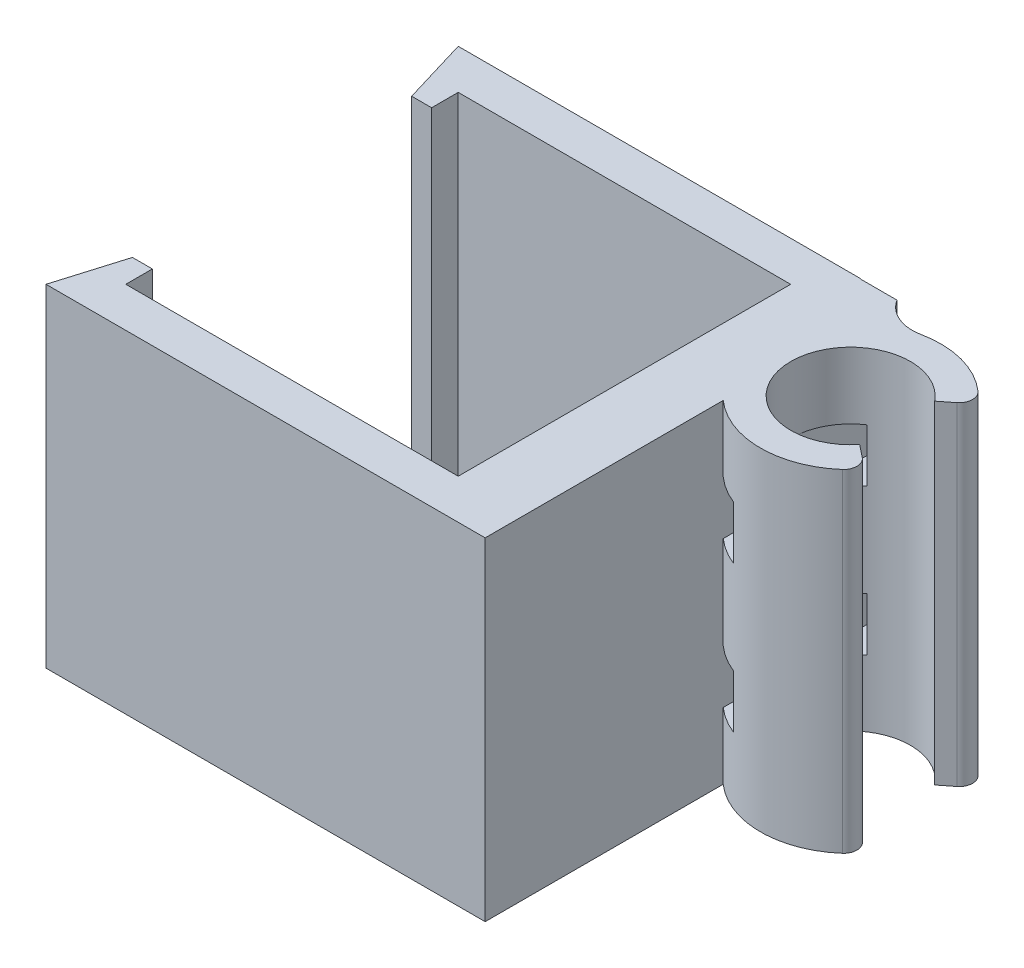
ISO-10303-21;
HEADER;
FILE_DESCRIPTION(('STEP AP214'),'2;1');
FILE_NAME('part.step','',(''),(''),'','','');
FILE_SCHEMA(('AUTOMOTIVE_DESIGN { 1 0 10303 214 1 1 1 1 }'));
ENDSEC;
DATA;
#1=APPLICATION_CONTEXT('core data for automotive mechanical design processes');
#2=APPLICATION_PROTOCOL_DEFINITION('international standard','automotive_design',2000,#1);
#3=PRODUCT_CONTEXT('',#1,'mechanical');
#4=PRODUCT('Part','Part','',(#3));
#5=PRODUCT_RELATED_PRODUCT_CATEGORY('part','',(#4));
#6=PRODUCT_DEFINITION_FORMATION('','',#4);
#7=PRODUCT_DEFINITION_CONTEXT('part definition',#1,'design');
#8=PRODUCT_DEFINITION('design','',#6,#7);
#9=PRODUCT_DEFINITION_SHAPE('','',#8);
#10=(LENGTH_UNIT() NAMED_UNIT(*) SI_UNIT(.MILLI.,.METRE.));
#11=(NAMED_UNIT(*) PLANE_ANGLE_UNIT() SI_UNIT($,.RADIAN.));
#12=(NAMED_UNIT(*) SI_UNIT($,.STERADIAN.) SOLID_ANGLE_UNIT());
#13=UNCERTAINTY_MEASURE_WITH_UNIT(LENGTH_MEASURE(1.E-05),#10,'distance_accuracy_value','');
#14=(GEOMETRIC_REPRESENTATION_CONTEXT(3) GLOBAL_UNCERTAINTY_ASSIGNED_CONTEXT((#13)) GLOBAL_UNIT_ASSIGNED_CONTEXT((#10,
#11,#12)) REPRESENTATION_CONTEXT('',''));
#15=CARTESIAN_POINT('',(0.,0.,0.));
#16=DIRECTION('',(0.,0.,1.));
#17=DIRECTION('',(1.,0.,0.));
#18=AXIS2_PLACEMENT_3D('',#15,#16,#17);
#19=CARTESIAN_POINT('',(-36.5790075050805,25.,-34.9697397940122));
#20=DIRECTION('',(0.,0.,1.));
#21=DIRECTION('',(1.,0.,0.));
#22=AXIS2_PLACEMENT_3D('',#19,#20,#21);
#23=PLANE('',#22);
#24=DIRECTION('',(-1.,0.,0.));
#25=VECTOR('',#24,1.);
#26=CARTESIAN_POINT('',(-36.5790075050805,0.,-34.9697397940122));
#27=LINE('',#26,#25);
#28=CARTESIAN_POINT('',(-36.5790075050805,0.,-34.9697397940122));
#29=VERTEX_POINT('',#28);
#30=CARTESIAN_POINT('',(-66.8257575757576,0.,-34.9697397940122));
#31=VERTEX_POINT('',#30);
#32=EDGE_CURVE('E305',#29,#31,#27,.T.);
#33=ORIENTED_EDGE('',*,*,#32,.T.);
#34=DIRECTION('',(0.,-1.,0.));
#35=VECTOR('',#34,1.);
#36=CARTESIAN_POINT('',(-66.8257575757576,25.,-34.9697397940122));
#37=LINE('',#36,#35);
#38=CARTESIAN_POINT('',(-66.8257575757576,25.,-34.9697397940122));
#39=VERTEX_POINT('',#38);
#40=EDGE_CURVE('E372',#39,#31,#37,.T.);
#41=ORIENTED_EDGE('',*,*,#40,.F.);
#42=DIRECTION('',(-1.,0.,0.));
#43=VECTOR('',#42,1.);
#44=CARTESIAN_POINT('',(-36.5790075050805,25.,-34.9697397940122));
#45=LINE('',#44,#43);
#46=CARTESIAN_POINT('',(-36.5790075050805,25.,-34.9697397940122));
#47=VERTEX_POINT('',#46);
#48=EDGE_CURVE('E312',#47,#39,#45,.T.);
#49=ORIENTED_EDGE('',*,*,#48,.F.);
#50=DIRECTION('',(0.,-1.,0.));
#51=VECTOR('',#50,1.);
#52=CARTESIAN_POINT('',(-36.5790075050805,25.,-34.9697397940122));
#53=LINE('',#52,#51);
#54=EDGE_CURVE('E330',#47,#29,#53,.T.);
#55=ORIENTED_EDGE('',*,*,#54,.T.);
#56=EDGE_LOOP('',(#33,#41,#49,#55));
#57=FACE_BOUND('',#56,.T.);
#58=ADVANCED_FACE('F35',(#57),#23,.F.);
#59=CARTESIAN_POINT('',(-66.8257575757576,25.,-29.9697397940122));
#60=DIRECTION('',(0.,0.,-1.));
#61=DIRECTION('',(-1.,0.,0.));
#62=AXIS2_PLACEMENT_3D('',#59,#60,#61);
#63=PLANE('',#62);
#64=DIRECTION('',(1.,0.,0.));
#65=VECTOR('',#64,1.);
#66=CARTESIAN_POINT('',(-66.8257575757576,25.,-29.9697397940122));
#67=LINE('',#66,#65);
#68=CARTESIAN_POINT('',(-65.3257575757576,25.,-29.9697397940122));
#69=VERTEX_POINT('',#68);
#70=CARTESIAN_POINT('',(-63.8257575757576,25.,-29.9697397940122));
#71=VERTEX_POINT('',#70);
#72=EDGE_CURVE('E315',#69,#71,#67,.T.);
#73=ORIENTED_EDGE('',*,*,#72,.F.);
#74=DIRECTION('',(0.,-1.,0.));
#75=VECTOR('',#74,1.);
#76=CARTESIAN_POINT('',(-65.3257575757576,25.,-29.9697397940122));
#77=LINE('',#76,#75);
#78=CARTESIAN_POINT('',(-65.3257575757576,0.,-29.9697397940122));
#79=VERTEX_POINT('',#78);
#80=EDGE_CURVE('E303',#69,#79,#77,.T.);
#81=ORIENTED_EDGE('',*,*,#80,.T.);
#82=DIRECTION('',(1.,0.,0.));
#83=VECTOR('',#82,1.);
#84=CARTESIAN_POINT('',(-66.8257575757576,0.,-29.9697397940122));
#85=LINE('',#84,#83);
#86=CARTESIAN_POINT('',(-63.8257575757576,0.,-29.9697397940122));
#87=VERTEX_POINT('',#86);
#88=EDGE_CURVE('E333',#79,#87,#85,.T.);
#89=ORIENTED_EDGE('',*,*,#88,.T.);
#90=DIRECTION('',(0.,-1.,0.));
#91=VECTOR('',#90,1.);
#92=CARTESIAN_POINT('',(-63.8257575757576,25.,-29.9697397940122));
#93=LINE('',#92,#91);
#94=EDGE_CURVE('E369',#71,#87,#93,.T.);
#95=ORIENTED_EDGE('',*,*,#94,.F.);
#96=EDGE_LOOP('',(#73,#81,#89,#95));
#97=FACE_BOUND('',#96,.T.);
#98=ADVANCED_FACE('F573',(#97),#63,.F.);
#99=CARTESIAN_POINT('',(-63.8257575757576,25.,-29.9697397940122));
#100=DIRECTION('',(-1.,0.,0.));
#101=DIRECTION('',(0.,0.,1.));
#102=AXIS2_PLACEMENT_3D('',#99,#100,#101);
#103=PLANE('',#102);
#104=DIRECTION('',(0.,0.,-1.));
#105=VECTOR('',#104,1.);
#106=CARTESIAN_POINT('',(-63.8257575757576,0.,-29.9697397940122));
#107=LINE('',#106,#105);
#108=CARTESIAN_POINT('',(-63.8257575757576,0.,-31.9697397940122));
#109=VERTEX_POINT('',#108);
#110=EDGE_CURVE('E335',#87,#109,#107,.T.);
#111=ORIENTED_EDGE('',*,*,#110,.T.);
#112=DIRECTION('',(0.,-1.,0.));
#113=VECTOR('',#112,1.);
#114=CARTESIAN_POINT('',(-63.8257575757576,25.,-31.9697397940122));
#115=LINE('',#114,#113);
#116=CARTESIAN_POINT('',(-63.8257575757576,25.,-31.9697397940122));
#117=VERTEX_POINT('',#116);
#118=EDGE_CURVE('E366',#117,#109,#115,.T.);
#119=ORIENTED_EDGE('',*,*,#118,.F.);
#120=DIRECTION('',(0.,0.,-1.));
#121=VECTOR('',#120,1.);
#122=CARTESIAN_POINT('',(-63.8257575757576,25.,-29.9697397940122));
#123=LINE('',#122,#121);
#124=EDGE_CURVE('E318',#71,#117,#123,.T.);
#125=ORIENTED_EDGE('',*,*,#124,.F.);
#126=ORIENTED_EDGE('',*,*,#94,.T.);
#127=EDGE_LOOP('',(#111,#119,#125,#126));
#128=FACE_BOUND('',#127,.T.);
#129=ADVANCED_FACE('F579',(#128),#103,.F.);
#130=CARTESIAN_POINT('',(-63.8257575757576,25.,-31.9697397940122));
#131=DIRECTION('',(0.,0.,-1.));
#132=DIRECTION('',(-1.,0.,0.));
#133=AXIS2_PLACEMENT_3D('',#130,#131,#132);
#134=PLANE('',#133);
#135=DIRECTION('',(1.,0.,0.));
#136=VECTOR('',#135,1.);
#137=CARTESIAN_POINT('',(-63.8257575757576,0.,-31.9697397940122));
#138=LINE('',#137,#136);
#139=CARTESIAN_POINT('',(-38.8257575757576,0.,-31.9697397940122));
#140=VERTEX_POINT('',#139);
#141=EDGE_CURVE('E337',#109,#140,#138,.T.);
#142=ORIENTED_EDGE('',*,*,#141,.T.);
#143=DIRECTION('',(0.,-1.,0.));
#144=VECTOR('',#143,1.);
#145=CARTESIAN_POINT('',(-38.8257575757576,25.,-31.9697397940122));
#146=LINE('',#145,#144);
#147=CARTESIAN_POINT('',(-38.8257575757576,25.,-31.9697397940122));
#148=VERTEX_POINT('',#147);
#149=EDGE_CURVE('E363',#148,#140,#146,.T.);
#150=ORIENTED_EDGE('',*,*,#149,.F.);
#151=DIRECTION('',(1.,0.,0.));
#152=VECTOR('',#151,1.);
#153=CARTESIAN_POINT('',(-63.8257575757576,25.,-31.9697397940122));
#154=LINE('',#153,#152);
#155=EDGE_CURVE('E320',#117,#148,#154,.T.);
#156=ORIENTED_EDGE('',*,*,#155,.F.);
#157=ORIENTED_EDGE('',*,*,#118,.T.);
#158=EDGE_LOOP('',(#142,#150,#156,#157));
#159=FACE_BOUND('',#158,.T.);
#160=ADVANCED_FACE('F585',(#159),#134,.F.);
#161=CARTESIAN_POINT('',(-38.8257575757576,25.,-31.9697397940122));
#162=DIRECTION('',(1.,0.,0.));
#163=DIRECTION('',(0.,0.,-1.));
#164=AXIS2_PLACEMENT_3D('',#161,#162,#163);
#165=PLANE('',#164);
#166=DIRECTION('',(0.,0.,1.));
#167=VECTOR('',#166,1.);
#168=CARTESIAN_POINT('',(-38.8257575757576,0.,-31.9697397940122));
#169=LINE('',#168,#167);
#170=CARTESIAN_POINT('',(-38.8257575757576,0.,-6.96973979401218));
#171=VERTEX_POINT('',#170);
#172=EDGE_CURVE('E339',#140,#171,#169,.T.);
#173=ORIENTED_EDGE('',*,*,#172,.T.);
#174=DIRECTION('',(0.,-1.,0.));
#175=VECTOR('',#174,1.);
#176=CARTESIAN_POINT('',(-38.8257575757576,25.,-6.96973979401218));
#177=LINE('',#176,#175);
#178=CARTESIAN_POINT('',(-38.8257575757576,25.,-6.96973979401218));
#179=VERTEX_POINT('',#178);
#180=EDGE_CURVE('E360',#179,#171,#177,.T.);
#181=ORIENTED_EDGE('',*,*,#180,.F.);
#182=DIRECTION('',(0.,0.,1.));
#183=VECTOR('',#182,1.);
#184=CARTESIAN_POINT('',(-38.8257575757576,25.,-31.9697397940122));
#185=LINE('',#184,#183);
#186=EDGE_CURVE('E322',#148,#179,#185,.T.);
#187=ORIENTED_EDGE('',*,*,#186,.F.);
#188=ORIENTED_EDGE('',*,*,#149,.T.);
#189=EDGE_LOOP('',(#173,#181,#187,#188));
#190=FACE_BOUND('',#189,.T.);
#191=ADVANCED_FACE('F589',(#190),#165,.F.);
#192=CARTESIAN_POINT('',(-38.8257575757576,25.,-6.96973979401218));
#193=DIRECTION('',(0.,0.,1.));
#194=DIRECTION('',(1.,0.,0.));
#195=AXIS2_PLACEMENT_3D('',#192,#193,#194);
#196=PLANE('',#195);
#197=DIRECTION('',(-1.,0.,0.));
#198=VECTOR('',#197,1.);
#199=CARTESIAN_POINT('',(-38.8257575757576,0.,-6.96973979401218));
#200=LINE('',#199,#198);
#201=CARTESIAN_POINT('',(-63.8257575757576,0.,-6.96973979401218));
#202=VERTEX_POINT('',#201);
#203=EDGE_CURVE('E341',#171,#202,#200,.T.);
#204=ORIENTED_EDGE('',*,*,#203,.T.);
#205=DIRECTION('',(0.,-1.,0.));
#206=VECTOR('',#205,1.);
#207=CARTESIAN_POINT('',(-63.8257575757576,25.,-6.96973979401218));
#208=LINE('',#207,#206);
#209=CARTESIAN_POINT('',(-63.8257575757576,25.,-6.96973979401218));
#210=VERTEX_POINT('',#209);
#211=EDGE_CURVE('E357',#210,#202,#208,.T.);
#212=ORIENTED_EDGE('',*,*,#211,.F.);
#213=DIRECTION('',(-1.,0.,0.));
#214=VECTOR('',#213,1.);
#215=CARTESIAN_POINT('',(-38.8257575757576,25.,-6.96973979401218));
#216=LINE('',#215,#214);
#217=EDGE_CURVE('E324',#179,#210,#216,.T.);
#218=ORIENTED_EDGE('',*,*,#217,.F.);
#219=ORIENTED_EDGE('',*,*,#180,.T.);
#220=EDGE_LOOP('',(#204,#212,#218,#219));
#221=FACE_BOUND('',#220,.T.);
#222=ADVANCED_FACE('F594',(#221),#196,.F.);
#223=CARTESIAN_POINT('',(-63.8257575757576,25.,-6.96973979401218));
#224=DIRECTION('',(-1.,0.,0.));
#225=DIRECTION('',(0.,0.,1.));
#226=AXIS2_PLACEMENT_3D('',#223,#224,#225);
#227=PLANE('',#226);
#228=DIRECTION('',(0.,0.,-1.));
#229=VECTOR('',#228,1.);
#230=CARTESIAN_POINT('',(-63.8257575757576,0.,-6.96973979401218));
#231=LINE('',#230,#229);
#232=CARTESIAN_POINT('',(-63.8257575757576,0.,-8.96973979401218));
#233=VERTEX_POINT('',#232);
#234=EDGE_CURVE('E343',#202,#233,#231,.T.);
#235=ORIENTED_EDGE('',*,*,#234,.T.);
#236=DIRECTION('',(0.,-1.,0.));
#237=VECTOR('',#236,1.);
#238=CARTESIAN_POINT('',(-63.8257575757576,25.,-8.96973979401218));
#239=LINE('',#238,#237);
#240=CARTESIAN_POINT('',(-63.8257575757576,25.,-8.96973979401218));
#241=VERTEX_POINT('',#240);
#242=EDGE_CURVE('E354',#241,#233,#239,.T.);
#243=ORIENTED_EDGE('',*,*,#242,.F.);
#244=DIRECTION('',(0.,0.,-1.));
#245=VECTOR('',#244,1.);
#246=CARTESIAN_POINT('',(-63.8257575757576,25.,-6.96973979401218));
#247=LINE('',#246,#245);
#248=EDGE_CURVE('E326',#210,#241,#247,.T.);
#249=ORIENTED_EDGE('',*,*,#248,.F.);
#250=ORIENTED_EDGE('',*,*,#211,.T.);
#251=EDGE_LOOP('',(#235,#243,#249,#250));
#252=FACE_BOUND('',#251,.T.);
#253=ADVANCED_FACE('F599',(#252),#227,.F.);
#254=CARTESIAN_POINT('',(-63.8257575757576,25.,-8.96973979401218));
#255=DIRECTION('',(0.,0.,1.));
#256=DIRECTION('',(1.,0.,0.));
#257=AXIS2_PLACEMENT_3D('',#254,#255,#256);
#258=PLANE('',#257);
#259=DIRECTION('',(-1.,0.,0.));
#260=VECTOR('',#259,1.);
#261=CARTESIAN_POINT('',(-63.8257575757576,0.,-8.96973979401218));
#262=LINE('',#261,#260);
#263=CARTESIAN_POINT('',(-65.3257575757576,0.,-8.96973979401218));
#264=VERTEX_POINT('',#263);
#265=EDGE_CURVE('E345',#233,#264,#262,.T.);
#266=ORIENTED_EDGE('',*,*,#265,.T.);
#267=DIRECTION('',(0.,-1.,0.));
#268=VECTOR('',#267,1.);
#269=CARTESIAN_POINT('',(-65.3257575757576,25.,-8.96973979401218));
#270=LINE('',#269,#268);
#271=CARTESIAN_POINT('',(-65.3257575757576,25.,-8.96973979401218));
#272=VERTEX_POINT('',#271);
#273=EDGE_CURVE('E300',#272,#264,#270,.T.);
#274=ORIENTED_EDGE('',*,*,#273,.F.);
#275=DIRECTION('',(-1.,0.,0.));
#276=VECTOR('',#275,1.);
#277=CARTESIAN_POINT('',(-63.8257575757576,25.,-8.96973979401218));
#278=LINE('',#277,#276);
#279=EDGE_CURVE('E280',#241,#272,#278,.T.);
#280=ORIENTED_EDGE('',*,*,#279,.F.);
#281=ORIENTED_EDGE('',*,*,#242,.T.);
#282=EDGE_LOOP('',(#266,#274,#280,#281));
#283=FACE_BOUND('',#282,.T.);
#284=ADVANCED_FACE('F604',(#283),#258,.F.);
#285=CARTESIAN_POINT('',(-66.8257575757576,25.,-3.96973979401218));
#286=DIRECTION('',(0.,0.,-1.));
#287=DIRECTION('',(-1.,0.,0.));
#288=AXIS2_PLACEMENT_3D('',#285,#286,#287);
#289=PLANE('',#288);
#290=DIRECTION('',(1.,0.,0.));
#291=VECTOR('',#290,1.);
#292=CARTESIAN_POINT('',(-66.8257575757576,0.,-3.96973979401218));
#293=LINE('',#292,#291);
#294=CARTESIAN_POINT('',(-66.8257575757576,0.,-3.96973979401218));
#295=VERTEX_POINT('',#294);
#296=CARTESIAN_POINT('',(-33.7989439252784,0.,-3.96973979401218));
#297=VERTEX_POINT('',#296);
#298=EDGE_CURVE('E284',#295,#297,#293,.T.);
#299=ORIENTED_EDGE('',*,*,#298,.T.);
#300=DIRECTION('',(0.,-1.,0.));
#301=VECTOR('',#300,1.);
#302=CARTESIAN_POINT('',(-33.7989439252784,56.3695655108971,-3.96973979401218));
#303=LINE('',#302,#301);
#304=CARTESIAN_POINT('',(-33.7989439252784,25.,-3.96973979401218));
#305=VERTEX_POINT('',#304);
#306=EDGE_CURVE('E260',#305,#297,#303,.T.);
#307=ORIENTED_EDGE('',*,*,#306,.F.);
#308=DIRECTION('',(1.,0.,0.));
#309=VECTOR('',#308,1.);
#310=CARTESIAN_POINT('',(-66.8257575757576,25.,-3.96973979401218));
#311=LINE('',#310,#309);
#312=CARTESIAN_POINT('',(-66.8257575757576,25.,-3.96973979401218));
#313=VERTEX_POINT('',#312);
#314=EDGE_CURVE('E273',#313,#305,#311,.T.);
#315=ORIENTED_EDGE('',*,*,#314,.F.);
#316=DIRECTION('',(0.,-1.,0.));
#317=VECTOR('',#316,1.);
#318=CARTESIAN_POINT('',(-66.8257575757576,25.,-3.96973979401218));
#319=LINE('',#318,#317);
#320=EDGE_CURVE('E352',#313,#295,#319,.T.);
#321=ORIENTED_EDGE('',*,*,#320,.T.);
#322=EDGE_LOOP('',(#299,#307,#315,#321));
#323=FACE_BOUND('',#322,.T.);
#324=ADVANCED_FACE('F282',(#323),#289,.F.);
#325=CARTESIAN_POINT('',(-22.1234701022757,25.,-3.96973979401218));
#326=DIRECTION('',(-0.906307787036653,0.,0.422618261740694));
#327=DIRECTION('',(0.422618261740694,0.,0.906307787036653));
#328=AXIS2_PLACEMENT_3D('',#325,#326,#327);
#329=PLANE('',#328);
#330=DIRECTION('',(-0.422618261740694,0.,-0.906307787036653));
#331=VECTOR('',#330,1.);
#332=CARTESIAN_POINT('',(-22.1234701022757,25.,-3.96973979401218));
#333=LINE('',#332,#331);
#334=CARTESIAN_POINT('',(-36.5643312219053,25.,-34.9382664031757));
#335=VERTEX_POINT('',#334);
#336=EDGE_CURVE('E279',#335,#47,#333,.T.);
#337=ORIENTED_EDGE('',*,*,#336,.F.);
#338=DIRECTION('',(0.,-1.,0.));
#339=VECTOR('',#338,1.);
#340=CARTESIAN_POINT('',(-36.5643312219053,25.,-34.9382664031757));
#341=LINE('',#340,#339);
#342=CARTESIAN_POINT('',(-36.5643312219053,0.,-34.9382664031757));
#343=VERTEX_POINT('',#342);
#344=EDGE_CURVE('E285',#335,#343,#341,.T.);
#345=ORIENTED_EDGE('',*,*,#344,.T.);
#346=DIRECTION('',(-0.422618261740694,0.,-0.906307787036653));
#347=VECTOR('',#346,1.);
#348=CARTESIAN_POINT('',(-22.1234701022757,0.,-3.96973979401218));
#349=LINE('',#348,#347);
#350=EDGE_CURVE('E316',#343,#29,#349,.T.);
#351=ORIENTED_EDGE('',*,*,#350,.T.);
#352=ORIENTED_EDGE('',*,*,#54,.F.);
#353=EDGE_LOOP('',(#337,#345,#351,#352));
#354=FACE_BOUND('',#353,.T.);
#355=ADVANCED_FACE('F564',(#354),#329,.F.);
#356=CARTESIAN_POINT('',(0.,25.,0.));
#357=DIRECTION('',(0.,1.,0.));
#358=DIRECTION('',(0.,0.,1.));
#359=AXIS2_PLACEMENT_3D('',#356,#357,#358);
#360=PLANE('',#359);
#361=DIRECTION('',(0.,0.,-1.));
#362=VECTOR('',#361,1.);
#363=CARTESIAN_POINT('',(-33.7989439252784,25.,-3.96973979401218));
#364=LINE('',#363,#362);
#365=CARTESIAN_POINT('',(-33.7989439252784,25.,-21.8737343114339));
#366=VERTEX_POINT('',#365);
#367=EDGE_CURVE('E256',#366,#305,#364,.F.);
#368=ORIENTED_EDGE('',*,*,#367,.F.);
#369=CARTESIAN_POINT('',(-29.2989439252784,25.,-26.9540030985939));
#370=DIRECTION('',(0.,1.,0.));
#371=DIRECTION('',(0.,0.,1.));
#372=AXIS2_PLACEMENT_3D('',#369,#370,#371);
#373=CIRCLE('',#372,6.78668777459167);
#374=CARTESIAN_POINT('',(-24.8206506283003,25.,-21.8545893973893));
#375=VERTEX_POINT('',#374);
#376=EDGE_CURVE('E501',#375,#366,#373,.F.);
#377=ORIENTED_EDGE('',*,*,#376,.F.);
#378=CARTESIAN_POINT('',(-25.4805149753451,25.,-22.6059741480325));
#379=DIRECTION('',(0.,1.,0.));
#380=DIRECTION('',(0.,0.,1.));
#381=AXIS2_PLACEMENT_3D('',#378,#379,#380);
#382=CIRCLE('',#381,1.);
#383=CARTESIAN_POINT('',(-24.8612617867617,25.,-23.3911655186098));
#384=VERTEX_POINT('',#383);
#385=EDGE_CURVE('E385',#375,#384,#382,.T.);
#386=ORIENTED_EDGE('',*,*,#385,.T.);
#387=DIRECTION('',(0.785191370577378,0.,0.61925318858349));
#388=VECTOR('',#387,1.);
#389=CARTESIAN_POINT('',(-25.7989439252784,25.,-24.130682884583));
#390=LINE('',#389,#388);
#391=CARTESIAN_POINT('',(-25.7989439252784,25.,-24.130682884583));
#392=VERTEX_POINT('',#391);
#393=EDGE_CURVE('E481',#392,#384,#390,.T.);
#394=ORIENTED_EDGE('',*,*,#393,.F.);
#395=CARTESIAN_POINT('',(-29.2989439252784,25.,-26.9540030985939));
#396=DIRECTION('',(0.,1.,0.));
#397=DIRECTION('',(0.,0.,1.));
#398=AXIS2_PLACEMENT_3D('',#395,#396,#397);
#399=CIRCLE('',#398,4.49679185985327);
#400=CARTESIAN_POINT('',(-25.7989439252784,25.,-29.7773233126048));
#401=VERTEX_POINT('',#400);
#402=EDGE_CURVE('E494',#401,#392,#399,.T.);
#403=ORIENTED_EDGE('',*,*,#402,.F.);
#404=DIRECTION('',(-0.785191370577378,0.,0.61925318858349));
#405=VECTOR('',#404,1.);
#406=CARTESIAN_POINT('',(-25.7989439252784,25.,-29.7773233126048));
#407=LINE('',#406,#405);
#408=CARTESIAN_POINT('',(-24.8612617867617,25.,-30.516840678578));
#409=VERTEX_POINT('',#408);
#410=EDGE_CURVE('E499',#409,#401,#407,.T.);
#411=ORIENTED_EDGE('',*,*,#410,.F.);
#412=CARTESIAN_POINT('',(-25.4805149753451,25.,-31.3020320491554));
#413=DIRECTION('',(0.,1.,0.));
#414=DIRECTION('',(0.,0.,1.));
#415=AXIS2_PLACEMENT_3D('',#412,#413,#414);
#416=CIRCLE('',#415,1.);
#417=CARTESIAN_POINT('',(-24.8206506283003,25.,-32.0534167997986));
#418=VERTEX_POINT('',#417);
#419=EDGE_CURVE('E387',#409,#418,#416,.T.);
#420=ORIENTED_EDGE('',*,*,#419,.T.);
#421=CARTESIAN_POINT('',(-30.6611395930074,25.,-33.6025784281373));
#422=VERTEX_POINT('',#421);
#423=EDGE_CURVE('E493',#422,#418,#373,.F.);
#424=ORIENTED_EDGE('',*,*,#423,.F.);
#425=CARTESIAN_POINT('',(-31.2632870821679,25.,-36.5415269478119));
#426=DIRECTION('',(0.,1.,0.));
#427=DIRECTION('',(0.,0.,1.));
#428=AXIS2_PLACEMENT_3D('',#425,#426,#427);
#429=CIRCLE('',#428,3.);
#430=CARTESIAN_POINT('',(-33.7989439252784,25.,-34.9382664031757));
#431=VERTEX_POINT('',#430);
#432=EDGE_CURVE('E377',#422,#431,#429,.F.);
#433=ORIENTED_EDGE('',*,*,#432,.T.);
#434=DIRECTION('',(1.,0.,0.));
#435=VECTOR('',#434,1.);
#436=CARTESIAN_POINT('',(-38.7989439252784,25.,-34.9382664031757));
#437=LINE('',#436,#435);
#438=EDGE_CURVE('E296',#335,#431,#437,.T.);
#439=ORIENTED_EDGE('',*,*,#438,.F.);
#440=ORIENTED_EDGE('',*,*,#336,.T.);
#441=ORIENTED_EDGE('',*,*,#48,.T.);
#442=DIRECTION('',(0.287347885566346,0.,0.957826285221151));
#443=VECTOR('',#442,1.);
#444=CARTESIAN_POINT('',(-66.8257575757576,25.,-34.9697397940122));
#445=LINE('',#444,#443);
#446=EDGE_CURVE('E306',#39,#69,#445,.T.);
#447=ORIENTED_EDGE('',*,*,#446,.T.);
#448=ORIENTED_EDGE('',*,*,#72,.T.);
#449=ORIENTED_EDGE('',*,*,#124,.T.);
#450=ORIENTED_EDGE('',*,*,#155,.T.);
#451=ORIENTED_EDGE('',*,*,#186,.T.);
#452=ORIENTED_EDGE('',*,*,#217,.T.);
#453=ORIENTED_EDGE('',*,*,#248,.T.);
#454=ORIENTED_EDGE('',*,*,#279,.T.);
#455=DIRECTION('',(-0.287347885566346,0.,0.957826285221151));
#456=VECTOR('',#455,1.);
#457=CARTESIAN_POINT('',(-66.8257575757576,25.,-3.96973979401218));
#458=LINE('',#457,#456);
#459=EDGE_CURVE('E276',#272,#313,#458,.T.);
#460=ORIENTED_EDGE('',*,*,#459,.T.);
#461=ORIENTED_EDGE('',*,*,#314,.T.);
#462=EDGE_LOOP('',(#368,#377,#386,#394,#403,#411,#420,#424,#433,#439,#440,#441,#447,#448,#449,
#450,#451,#452,#453,#454,#460,#461));
#463=FACE_BOUND('',#462,.T.);
#464=ADVANCED_FACE('F274',(#463),#360,.T.);
#465=CARTESIAN_POINT('',(0.,0.,0.));
#466=DIRECTION('',(0.,1.,0.));
#467=DIRECTION('',(0.,0.,1.));
#468=AXIS2_PLACEMENT_3D('',#465,#466,#467);
#469=PLANE('',#468);
#470=CARTESIAN_POINT('',(-29.2989439252784,0.,-26.9540030985939));
#471=DIRECTION('',(0.,-1.,0.));
#472=DIRECTION('',(0.,0.,-1.));
#473=AXIS2_PLACEMENT_3D('',#470,#471,#472);
#474=CIRCLE('',#473,6.78668777459167);
#475=CARTESIAN_POINT('',(-24.8206506283003,0.,-21.8545893973893));
#476=VERTEX_POINT('',#475);
#477=CARTESIAN_POINT('',(-33.7989439252784,0.,-21.8737343114339));
#478=VERTEX_POINT('',#477);
#479=EDGE_CURVE('E482',#476,#478,#474,.T.);
#480=ORIENTED_EDGE('',*,*,#479,.T.);
#481=DIRECTION('',(0.,0.,-1.));
#482=VECTOR('',#481,1.);
#483=CARTESIAN_POINT('',(-33.7989439252784,0.,-3.96973979401218));
#484=LINE('',#483,#482);
#485=EDGE_CURVE('E269',#478,#297,#484,.F.);
#486=ORIENTED_EDGE('',*,*,#485,.T.);
#487=ORIENTED_EDGE('',*,*,#298,.F.);
#488=DIRECTION('',(-0.287347885566346,0.,0.957826285221151));
#489=VECTOR('',#488,1.);
#490=CARTESIAN_POINT('',(-66.8257575757576,0.,-3.96973979401218));
#491=LINE('',#490,#489);
#492=EDGE_CURVE('E301',#264,#295,#491,.T.);
#493=ORIENTED_EDGE('',*,*,#492,.F.);
#494=ORIENTED_EDGE('',*,*,#265,.F.);
#495=ORIENTED_EDGE('',*,*,#234,.F.);
#496=ORIENTED_EDGE('',*,*,#203,.F.);
#497=ORIENTED_EDGE('',*,*,#172,.F.);
#498=ORIENTED_EDGE('',*,*,#141,.F.);
#499=ORIENTED_EDGE('',*,*,#110,.F.);
#500=ORIENTED_EDGE('',*,*,#88,.F.);
#501=DIRECTION('',(0.287347885566346,0.,0.957826285221151));
#502=VECTOR('',#501,1.);
#503=CARTESIAN_POINT('',(-66.8257575757576,0.,-34.9697397940122));
#504=LINE('',#503,#502);
#505=EDGE_CURVE('E289',#31,#79,#504,.T.);
#506=ORIENTED_EDGE('',*,*,#505,.F.);
#507=ORIENTED_EDGE('',*,*,#32,.F.);
#508=ORIENTED_EDGE('',*,*,#350,.F.);
#509=DIRECTION('',(1.,0.,0.));
#510=VECTOR('',#509,1.);
#511=CARTESIAN_POINT('',(-38.7989439252784,0.,-34.9382664031757));
#512=LINE('',#511,#510);
#513=CARTESIAN_POINT('',(-33.7989439252784,0.,-34.9382664031757));
#514=VERTEX_POINT('',#513);
#515=EDGE_CURVE('E507',#343,#514,#512,.T.);
#516=ORIENTED_EDGE('',*,*,#515,.T.);
#517=CARTESIAN_POINT('',(-31.2632870821679,0.,-36.5415269478119));
#518=DIRECTION('',(0.,1.,0.));
#519=DIRECTION('',(0.,0.,1.));
#520=AXIS2_PLACEMENT_3D('',#517,#518,#519);
#521=CIRCLE('',#520,3.);
#522=CARTESIAN_POINT('',(-30.6611395930074,0.,-33.6025784281373));
#523=VERTEX_POINT('',#522);
#524=EDGE_CURVE('E379',#514,#523,#521,.T.);
#525=ORIENTED_EDGE('',*,*,#524,.T.);
#526=CARTESIAN_POINT('',(-24.8206506283003,0.,-32.0534167997986));
#527=VERTEX_POINT('',#526);
#528=EDGE_CURVE('E485',#523,#527,#474,.T.);
#529=ORIENTED_EDGE('',*,*,#528,.T.);
#530=CARTESIAN_POINT('',(-25.4805149753451,0.,-31.3020320491554));
#531=DIRECTION('',(0.,1.,0.));
#532=DIRECTION('',(0.,0.,1.));
#533=AXIS2_PLACEMENT_3D('',#530,#531,#532);
#534=CIRCLE('',#533,1.);
#535=CARTESIAN_POINT('',(-24.8612617867617,0.,-30.516840678578));
#536=VERTEX_POINT('',#535);
#537=EDGE_CURVE('E383',#527,#536,#534,.F.);
#538=ORIENTED_EDGE('',*,*,#537,.T.);
#539=DIRECTION('',(-0.785191370577377,0.,0.61925318858349));
#540=VECTOR('',#539,1.);
#541=CARTESIAN_POINT('',(-25.7989439252784,0.,-29.7773233126048));
#542=LINE('',#541,#540);
#543=CARTESIAN_POINT('',(-25.7989439252784,0.,-29.7773233126048));
#544=VERTEX_POINT('',#543);
#545=EDGE_CURVE('E479',#536,#544,#542,.T.);
#546=ORIENTED_EDGE('',*,*,#545,.T.);
#547=CARTESIAN_POINT('',(-29.2989439252784,0.,-26.9540030985939));
#548=DIRECTION('',(0.,1.,0.));
#549=DIRECTION('',(0.,0.,-1.));
#550=AXIS2_PLACEMENT_3D('',#547,#548,#549);
#551=CIRCLE('',#550,4.49679185985327);
#552=CARTESIAN_POINT('',(-25.7989439252784,0.,-24.130682884583));
#553=VERTEX_POINT('',#552);
#554=EDGE_CURVE('E478',#544,#553,#551,.T.);
#555=ORIENTED_EDGE('',*,*,#554,.T.);
#556=DIRECTION('',(0.785191370577377,0.,0.61925318858349));
#557=VECTOR('',#556,1.);
#558=CARTESIAN_POINT('',(-25.7989439252784,0.,-24.130682884583));
#559=LINE('',#558,#557);
#560=CARTESIAN_POINT('',(-24.8612617867617,0.,-23.3911655186098));
#561=VERTEX_POINT('',#560);
#562=EDGE_CURVE('E486',#553,#561,#559,.T.);
#563=ORIENTED_EDGE('',*,*,#562,.T.);
#564=CARTESIAN_POINT('',(-25.4805149753451,0.,-22.6059741480325));
#565=DIRECTION('',(0.,1.,0.));
#566=DIRECTION('',(0.,0.,1.));
#567=AXIS2_PLACEMENT_3D('',#564,#565,#566);
#568=CIRCLE('',#567,1.);
#569=EDGE_CURVE('E381',#561,#476,#568,.F.);
#570=ORIENTED_EDGE('',*,*,#569,.T.);
#571=EDGE_LOOP('',(#480,#486,#487,#493,#494,#495,#496,#497,#498,#499,#500,#506,#507,#508,#516,
#525,#529,#538,#546,#555,#563,#570));
#572=FACE_BOUND('',#571,.T.);
#573=ADVANCED_FACE('F540',(#572),#469,.F.);
#574=CARTESIAN_POINT('',(-66.8257575757576,25.,-34.9697397940122));
#575=DIRECTION('',(0.957826285221151,0.,-0.287347885566346));
#576=DIRECTION('',(-0.287347885566346,0.,-0.957826285221151));
#577=AXIS2_PLACEMENT_3D('',#574,#575,#576);
#578=PLANE('',#577);
#579=ORIENTED_EDGE('',*,*,#505,.T.);
#580=ORIENTED_EDGE('',*,*,#80,.F.);
#581=ORIENTED_EDGE('',*,*,#446,.F.);
#582=ORIENTED_EDGE('',*,*,#40,.T.);
#583=EDGE_LOOP('',(#579,#580,#581,#582));
#584=FACE_BOUND('',#583,.T.);
#585=ADVANCED_FACE('F780',(#584),#578,.F.);
#586=CARTESIAN_POINT('',(-66.8257575757576,25.,-3.96973979401218));
#587=DIRECTION('',(0.957826285221151,0.,0.287347885566346));
#588=DIRECTION('',(0.287347885566346,0.,-0.957826285221151));
#589=AXIS2_PLACEMENT_3D('',#586,#587,#588);
#590=PLANE('',#589);
#591=ORIENTED_EDGE('',*,*,#492,.T.);
#592=ORIENTED_EDGE('',*,*,#320,.F.);
#593=ORIENTED_EDGE('',*,*,#459,.F.);
#594=ORIENTED_EDGE('',*,*,#273,.T.);
#595=EDGE_LOOP('',(#591,#592,#593,#594));
#596=FACE_BOUND('',#595,.T.);
#597=ADVANCED_FACE('F607',(#596),#590,.F.);
#598=CARTESIAN_POINT('',(-38.7989439252784,56.3695655108971,-34.9382664031757));
#599=DIRECTION('',(0.,0.,-1.));
#600=DIRECTION('',(-1.,0.,0.));
#601=AXIS2_PLACEMENT_3D('',#598,#599,#600);
#602=PLANE('',#601);
#603=ORIENTED_EDGE('',*,*,#344,.F.);
#604=ORIENTED_EDGE('',*,*,#438,.T.);
#605=DIRECTION('',(0.,-1.,0.));
#606=VECTOR('',#605,1.);
#607=CARTESIAN_POINT('',(-33.7989439252784,56.3695655108971,-34.9382664031757));
#608=LINE('',#607,#606);
#609=CARTESIAN_POINT('',(-33.7989439252784,20.,-34.9382664031757));
#610=VERTEX_POINT('',#609);
#611=EDGE_CURVE('E286',#431,#610,#608,.T.);
#612=ORIENTED_EDGE('',*,*,#611,.T.);
#613=CARTESIAN_POINT('',(-33.7989439252784,16.,-34.9382664031757));
#614=VERTEX_POINT('',#613);
#615=EDGE_CURVE('E292',#610,#614,#608,.T.);
#616=ORIENTED_EDGE('',*,*,#615,.T.);
#617=CARTESIAN_POINT('',(-33.7989439252784,9.,-34.9382664031757));
#618=VERTEX_POINT('',#617);
#619=EDGE_CURVE('E519',#614,#618,#608,.T.);
#620=ORIENTED_EDGE('',*,*,#619,.T.);
#621=CARTESIAN_POINT('',(-33.7989439252784,5.,-34.9382664031757));
#622=VERTEX_POINT('',#621);
#623=EDGE_CURVE('E516',#618,#622,#608,.T.);
#624=ORIENTED_EDGE('',*,*,#623,.T.);
#625=EDGE_CURVE('E294',#622,#514,#608,.T.);
#626=ORIENTED_EDGE('',*,*,#625,.T.);
#627=ORIENTED_EDGE('',*,*,#515,.F.);
#628=EDGE_LOOP('',(#603,#604,#612,#616,#620,#624,#626,#627));
#629=FACE_BOUND('',#628,.T.);
#630=ADVANCED_FACE('F522',(#629),#602,.T.);
#631=CARTESIAN_POINT('',(-33.7989439252784,56.3695655108971,-3.96973979401218));
#632=DIRECTION('',(1.,0.,0.));
#633=DIRECTION('',(0.,0.,-1.));
#634=AXIS2_PLACEMENT_3D('',#631,#632,#633);
#635=PLANE('',#634);
#636=DIRECTION('',(0.,-1.,0.));
#637=VECTOR('',#636,1.);
#638=CARTESIAN_POINT('',(-33.7989439252784,43.1966780638106,-21.8737343114339));
#639=LINE('',#638,#637);
#640=CARTESIAN_POINT('',(-33.7989439252784,20.,-21.8737343114339));
#641=VERTEX_POINT('',#640);
#642=EDGE_CURVE('E264',#366,#641,#639,.T.);
#643=ORIENTED_EDGE('',*,*,#642,.F.);
#644=ORIENTED_EDGE('',*,*,#367,.T.);
#645=ORIENTED_EDGE('',*,*,#306,.T.);
#646=ORIENTED_EDGE('',*,*,#485,.F.);
#647=CARTESIAN_POINT('',(-33.7989439252784,5.,-21.8737343114339));
#648=VERTEX_POINT('',#647);
#649=EDGE_CURVE('E506',#648,#478,#639,.T.);
#650=ORIENTED_EDGE('',*,*,#649,.F.);
#651=DIRECTION('',(0.,0.,1.));
#652=VECTOR('',#651,1.);
#653=CARTESIAN_POINT('',(-33.7989439252784,5.,-34.9697397940122));
#654=LINE('',#653,#652);
#655=EDGE_CURVE('E50',#622,#648,#654,.T.);
#656=ORIENTED_EDGE('',*,*,#655,.F.);
#657=ORIENTED_EDGE('',*,*,#623,.F.);
#658=DIRECTION('',(0.,0.,1.));
#659=VECTOR('',#658,1.);
#660=CARTESIAN_POINT('',(-33.7989439252784,9.,-34.9697397940122));
#661=LINE('',#660,#659);
#662=CARTESIAN_POINT('',(-33.7989439252784,9.,-21.8737343114339));
#663=VERTEX_POINT('',#662);
#664=EDGE_CURVE('E438',#618,#663,#661,.T.);
#665=ORIENTED_EDGE('',*,*,#664,.T.);
#666=CARTESIAN_POINT('',(-33.7989439252784,16.,-21.8737343114339));
#667=VERTEX_POINT('',#666);
#668=EDGE_CURVE('E508',#667,#663,#639,.T.);
#669=ORIENTED_EDGE('',*,*,#668,.F.);
#670=DIRECTION('',(0.,0.,1.));
#671=VECTOR('',#670,1.);
#672=CARTESIAN_POINT('',(-33.7989439252784,16.,-34.9697397940122));
#673=LINE('',#672,#671);
#674=EDGE_CURVE('E58',#614,#667,#673,.T.);
#675=ORIENTED_EDGE('',*,*,#674,.F.);
#676=ORIENTED_EDGE('',*,*,#615,.F.);
#677=DIRECTION('',(0.,0.,1.));
#678=VECTOR('',#677,1.);
#679=CARTESIAN_POINT('',(-33.7989439252784,20.,-34.9697397940122));
#680=LINE('',#679,#678);
#681=EDGE_CURVE('E427',#610,#641,#680,.T.);
#682=ORIENTED_EDGE('',*,*,#681,.T.);
#683=EDGE_LOOP('',(#643,#644,#645,#646,#650,#656,#657,#665,#669,#675,#676,#682));
#684=FACE_BOUND('',#683,.T.);
#685=ADVANCED_FACE('F258',(#684),#635,.T.);
#686=CARTESIAN_POINT('',(-29.2989439252784,43.1966780638106,-26.9540030985939));
#687=DIRECTION('',(0.,-1.,0.));
#688=DIRECTION('',(0.,0.,-1.));
#689=AXIS2_PLACEMENT_3D('',#686,#687,#688);
#690=CYLINDRICAL_SURFACE('',#689,6.78668777459167);
#691=CARTESIAN_POINT('',(-29.2989439252784,20.,-26.9540030985939));
#692=DIRECTION('',(0.,1.,0.));
#693=DIRECTION('',(0.,0.,1.));
#694=AXIS2_PLACEMENT_3D('',#691,#692,#693);
#695=CIRCLE('',#694,6.78668777459167);
#696=CARTESIAN_POINT('',(-31.7989439252784,20.,-20.644555345439));
#697=VERTEX_POINT('',#696);
#698=EDGE_CURVE('E476',#697,#641,#695,.F.);
#699=ORIENTED_EDGE('',*,*,#698,.F.);
#700=DIRECTION('',(0.,-1.,0.));
#701=VECTOR('',#700,1.);
#702=CARTESIAN_POINT('',(-31.7989439252784,43.1966780638106,-20.644555345439));
#703=LINE('',#702,#701);
#704=CARTESIAN_POINT('',(-31.7989439252784,16.,-20.644555345439));
#705=VERTEX_POINT('',#704);
#706=EDGE_CURVE('E472',#705,#697,#703,.F.);
#707=ORIENTED_EDGE('',*,*,#706,.F.);
#708=CARTESIAN_POINT('',(-29.2989439252784,16.,-26.9540030985939));
#709=DIRECTION('',(0.,-1.,0.));
#710=DIRECTION('',(0.,0.,-1.));
#711=AXIS2_PLACEMENT_3D('',#708,#709,#710);
#712=CIRCLE('',#711,6.78668777459167);
#713=EDGE_CURVE('E466',#667,#705,#712,.F.);
#714=ORIENTED_EDGE('',*,*,#713,.F.);
#715=ORIENTED_EDGE('',*,*,#668,.T.);
#716=CARTESIAN_POINT('',(-29.2989439252784,9.,-26.9540030985939));
#717=DIRECTION('',(0.,1.,0.));
#718=DIRECTION('',(0.,0.,1.));
#719=AXIS2_PLACEMENT_3D('',#716,#717,#718);
#720=CIRCLE('',#719,6.78668777459167);
#721=CARTESIAN_POINT('',(-31.7989439252784,9.,-20.644555345439));
#722=VERTEX_POINT('',#721);
#723=EDGE_CURVE('E462',#722,#663,#720,.F.);
#724=ORIENTED_EDGE('',*,*,#723,.F.);
#725=DIRECTION('',(0.,-1.,0.));
#726=VECTOR('',#725,1.);
#727=CARTESIAN_POINT('',(-31.7989439252784,43.1966780638106,-20.644555345439));
#728=LINE('',#727,#726);
#729=CARTESIAN_POINT('',(-31.7989439252784,5.,-20.644555345439));
#730=VERTEX_POINT('',#729);
#731=EDGE_CURVE('E458',#730,#722,#728,.F.);
#732=ORIENTED_EDGE('',*,*,#731,.F.);
#733=CARTESIAN_POINT('',(-29.2989439252784,5.,-26.9540030985939));
#734=DIRECTION('',(0.,-1.,0.));
#735=DIRECTION('',(1.,0.,0.));
#736=AXIS2_PLACEMENT_3D('',#733,#734,#735);
#737=CIRCLE('',#736,6.78668777459167);
#738=EDGE_CURVE('E451',#648,#730,#737,.F.);
#739=ORIENTED_EDGE('',*,*,#738,.F.);
#740=ORIENTED_EDGE('',*,*,#649,.T.);
#741=ORIENTED_EDGE('',*,*,#479,.F.);
#742=DIRECTION('',(0.,-1.,0.));
#743=VECTOR('',#742,1.);
#744=CARTESIAN_POINT('',(-24.8206506283003,43.1966780638106,-21.8545893973893));
#745=LINE('',#744,#743);
#746=EDGE_CURVE('E397',#476,#375,#745,.F.);
#747=ORIENTED_EDGE('',*,*,#746,.T.);
#748=ORIENTED_EDGE('',*,*,#376,.T.);
#749=ORIENTED_EDGE('',*,*,#642,.T.);
#750=EDGE_LOOP('',(#699,#707,#714,#715,#724,#732,#739,#740,#741,#747,#748,#749));
#751=FACE_BOUND('',#750,.T.);
#752=ADVANCED_FACE('F530',(#751),#690,.T.);
#753=CARTESIAN_POINT('',(-25.7989439252784,43.1966780638106,-24.130682884583));
#754=DIRECTION('',(0.61925318858349,0.,-0.785191370577377));
#755=DIRECTION('',(-0.785191370577378,0.,-0.61925318858349));
#756=AXIS2_PLACEMENT_3D('',#753,#754,#755);
#757=PLANE('',#756);
#758=ORIENTED_EDGE('',*,*,#393,.T.);
#759=DIRECTION('',(0.,-1.,0.));
#760=VECTOR('',#759,1.);
#761=CARTESIAN_POINT('',(-24.8612617867617,43.1966780638106,-23.3911655186098));
#762=LINE('',#761,#760);
#763=EDGE_CURVE('E394',#384,#561,#762,.T.);
#764=ORIENTED_EDGE('',*,*,#763,.T.);
#765=ORIENTED_EDGE('',*,*,#562,.F.);
#766=DIRECTION('',(0.,-1.,0.));
#767=VECTOR('',#766,1.);
#768=CARTESIAN_POINT('',(-25.7989439252784,43.1966780638106,-24.130682884583));
#769=LINE('',#768,#767);
#770=EDGE_CURVE('E497',#392,#553,#769,.T.);
#771=ORIENTED_EDGE('',*,*,#770,.F.);
#772=EDGE_LOOP('',(#758,#764,#765,#771));
#773=FACE_BOUND('',#772,.T.);
#774=ADVANCED_FACE('F538',(#773),#757,.T.);
#775=ORIENTED_EDGE('',*,*,#423,.T.);
#776=DIRECTION('',(0.,-1.,0.));
#777=VECTOR('',#776,1.);
#778=CARTESIAN_POINT('',(-24.8206506283003,43.1966780638106,-32.0534167997986));
#779=LINE('',#778,#777);
#780=EDGE_CURVE('E389',#418,#527,#779,.T.);
#781=ORIENTED_EDGE('',*,*,#780,.T.);
#782=ORIENTED_EDGE('',*,*,#528,.F.);
#783=DIRECTION('',(0.,-1.,0.));
#784=VECTOR('',#783,1.);
#785=CARTESIAN_POINT('',(-30.6611395930074,43.1966780638106,-33.6025784281373));
#786=LINE('',#785,#784);
#787=EDGE_CURVE('E268',#523,#422,#786,.F.);
#788=ORIENTED_EDGE('',*,*,#787,.T.);
#789=EDGE_LOOP('',(#775,#781,#782,#788));
#790=FACE_BOUND('',#789,.T.);
#791=ADVANCED_FACE('F559',(#790),#690,.T.);
#792=CARTESIAN_POINT('',(-25.7989439252784,43.1966780638106,-29.7773233126048));
#793=DIRECTION('',(0.61925318858349,0.,0.785191370577377));
#794=DIRECTION('',(0.785191370577378,0.,-0.61925318858349));
#795=AXIS2_PLACEMENT_3D('',#792,#793,#794);
#796=PLANE('',#795);
#797=ORIENTED_EDGE('',*,*,#545,.F.);
#798=DIRECTION('',(0.,-1.,0.));
#799=VECTOR('',#798,1.);
#800=CARTESIAN_POINT('',(-24.8612617867617,43.1966780638106,-30.516840678578));
#801=LINE('',#800,#799);
#802=EDGE_CURVE('E392',#536,#409,#801,.F.);
#803=ORIENTED_EDGE('',*,*,#802,.T.);
#804=ORIENTED_EDGE('',*,*,#410,.T.);
#805=DIRECTION('',(0.,-1.,0.));
#806=VECTOR('',#805,1.);
#807=CARTESIAN_POINT('',(-25.7989439252784,43.1966780638106,-29.7773233126048));
#808=LINE('',#807,#806);
#809=EDGE_CURVE('E498',#401,#544,#808,.T.);
#810=ORIENTED_EDGE('',*,*,#809,.T.);
#811=EDGE_LOOP('',(#797,#803,#804,#810));
#812=FACE_BOUND('',#811,.T.);
#813=ADVANCED_FACE('F689',(#812),#796,.T.);
#814=CARTESIAN_POINT('',(-29.2989439252784,43.1966780638106,-26.9540030985939));
#815=DIRECTION('',(0.,-1.,0.));
#816=DIRECTION('',(0.,0.,-1.));
#817=AXIS2_PLACEMENT_3D('',#814,#815,#816);
#818=CYLINDRICAL_SURFACE('',#817,4.49679185985327);
#819=CARTESIAN_POINT('',(-29.2989439252784,20.,-26.9540030985939));
#820=DIRECTION('',(0.,1.,0.));
#821=DIRECTION('',(0.,0.,1.));
#822=AXIS2_PLACEMENT_3D('',#819,#820,#821);
#823=CIRCLE('',#822,4.49679185985327);
#824=CARTESIAN_POINT('',(-31.7989439252784,20.,-30.6918015189));
#825=VERTEX_POINT('',#824);
#826=CARTESIAN_POINT('',(-31.7989439252784,20.,-23.2162046782878));
#827=VERTEX_POINT('',#826);
#828=EDGE_CURVE('E474',#825,#827,#823,.T.);
#829=ORIENTED_EDGE('',*,*,#828,.F.);
#830=DIRECTION('',(0.,-1.,0.));
#831=VECTOR('',#830,1.);
#832=CARTESIAN_POINT('',(-31.7989439252784,43.1966780638106,-30.6918015189));
#833=LINE('',#832,#831);
#834=CARTESIAN_POINT('',(-31.7989439252784,16.,-30.6918015189));
#835=VERTEX_POINT('',#834);
#836=EDGE_CURVE('E424',#835,#825,#833,.F.);
#837=ORIENTED_EDGE('',*,*,#836,.F.);
#838=CARTESIAN_POINT('',(-29.2989439252784,16.,-26.9540030985939));
#839=DIRECTION('',(0.,-1.,0.));
#840=DIRECTION('',(0.,0.,-1.));
#841=AXIS2_PLACEMENT_3D('',#838,#839,#840);
#842=CIRCLE('',#841,4.49679185985327);
#843=CARTESIAN_POINT('',(-31.7989439252784,16.,-23.2162046782878));
#844=VERTEX_POINT('',#843);
#845=EDGE_CURVE('E464',#844,#835,#842,.T.);
#846=ORIENTED_EDGE('',*,*,#845,.F.);
#847=DIRECTION('',(0.,-1.,0.));
#848=VECTOR('',#847,1.);
#849=CARTESIAN_POINT('',(-31.7989439252784,43.1966780638106,-23.2162046782878));
#850=LINE('',#849,#848);
#851=EDGE_CURVE('E469',#827,#844,#850,.T.);
#852=ORIENTED_EDGE('',*,*,#851,.F.);
#853=EDGE_LOOP('',(#829,#837,#846,#852));
#854=FACE_BOUND('',#853,.T.);
#855=CARTESIAN_POINT('',(-29.2989439252784,9.,-26.9540030985939));
#856=DIRECTION('',(0.,1.,0.));
#857=DIRECTION('',(0.,0.,1.));
#858=AXIS2_PLACEMENT_3D('',#855,#856,#857);
#859=CIRCLE('',#858,4.49679185985327);
#860=CARTESIAN_POINT('',(-31.7989439252784,9.,-30.6918015189));
#861=VERTEX_POINT('',#860);
#862=CARTESIAN_POINT('',(-31.7989439252784,9.,-23.2162046782878));
#863=VERTEX_POINT('',#862);
#864=EDGE_CURVE('E460',#861,#863,#859,.T.);
#865=ORIENTED_EDGE('',*,*,#864,.F.);
#866=DIRECTION('',(0.,-1.,0.));
#867=VECTOR('',#866,1.);
#868=CARTESIAN_POINT('',(-31.7989439252784,43.1966780638106,-30.6918015189));
#869=LINE('',#868,#867);
#870=CARTESIAN_POINT('',(-31.7989439252784,5.,-30.6918015189));
#871=VERTEX_POINT('',#870);
#872=EDGE_CURVE('E453',#871,#861,#869,.F.);
#873=ORIENTED_EDGE('',*,*,#872,.F.);
#874=CARTESIAN_POINT('',(-29.2989439252784,5.,-26.9540030985939));
#875=DIRECTION('',(0.,-1.,0.));
#876=DIRECTION('',(1.,0.,0.));
#877=AXIS2_PLACEMENT_3D('',#874,#875,#876);
#878=CIRCLE('',#877,4.49679185985327);
#879=CARTESIAN_POINT('',(-31.7989439252784,5.,-23.2162046782878));
#880=VERTEX_POINT('',#879);
#881=EDGE_CURVE('E430',#880,#871,#878,.T.);
#882=ORIENTED_EDGE('',*,*,#881,.F.);
#883=DIRECTION('',(0.,-1.,0.));
#884=VECTOR('',#883,1.);
#885=CARTESIAN_POINT('',(-31.7989439252784,43.1966780638106,-23.2162046782878));
#886=LINE('',#885,#884);
#887=EDGE_CURVE('E455',#863,#880,#886,.T.);
#888=ORIENTED_EDGE('',*,*,#887,.F.);
#889=EDGE_LOOP('',(#865,#873,#882,#888));
#890=FACE_BOUND('',#889,.T.);
#891=ORIENTED_EDGE('',*,*,#809,.F.);
#892=ORIENTED_EDGE('',*,*,#402,.T.);
#893=ORIENTED_EDGE('',*,*,#770,.T.);
#894=ORIENTED_EDGE('',*,*,#554,.F.);
#895=EDGE_LOOP('',(#891,#892,#893,#894));
#896=FACE_BOUND('',#895,.T.);
#897=ADVANCED_FACE('F545',(#854,#890,#896),#818,.F.);
#898=CARTESIAN_POINT('',(-31.2632870821679,56.3695655108971,-36.5415269478119));
#899=DIRECTION('',(0.,-1.,0.));
#900=DIRECTION('',(0.,0.,-1.));
#901=AXIS2_PLACEMENT_3D('',#898,#899,#900);
#902=CYLINDRICAL_SURFACE('',#901,3.);
#903=DIRECTION('',(0.,-1.,0.));
#904=VECTOR('',#903,1.);
#905=CARTESIAN_POINT('',(-31.7989439252784,56.3695655108971,-33.5897356702265));
#906=LINE('',#905,#904);
#907=CARTESIAN_POINT('',(-31.7989439252784,16.,-33.5897356702265));
#908=VERTEX_POINT('',#907);
#909=CARTESIAN_POINT('',(-31.7989439252784,20.,-33.5897356702265));
#910=VERTEX_POINT('',#909);
#911=EDGE_CURVE('E43',#908,#910,#906,.F.);
#912=ORIENTED_EDGE('',*,*,#911,.T.);
#913=CARTESIAN_POINT('',(-31.2632870821679,20.,-36.5415269478119));
#914=DIRECTION('',(0.,1.,0.));
#915=DIRECTION('',(0.,0.,1.));
#916=AXIS2_PLACEMENT_3D('',#913,#914,#915);
#917=CIRCLE('',#916,3.);
#918=EDGE_CURVE('E11',#910,#610,#917,.F.);
#919=ORIENTED_EDGE('',*,*,#918,.T.);
#920=ORIENTED_EDGE('',*,*,#611,.F.);
#921=ORIENTED_EDGE('',*,*,#432,.F.);
#922=ORIENTED_EDGE('',*,*,#787,.F.);
#923=ORIENTED_EDGE('',*,*,#524,.F.);
#924=ORIENTED_EDGE('',*,*,#625,.F.);
#925=CARTESIAN_POINT('',(-31.2632870821679,5.,-36.5415269478119));
#926=DIRECTION('',(0.,-1.,0.));
#927=DIRECTION('',(1.,0.,0.));
#928=AXIS2_PLACEMENT_3D('',#925,#926,#927);
#929=CIRCLE('',#928,3.);
#930=CARTESIAN_POINT('',(-31.7989439252784,5.,-33.5897356702265));
#931=VERTEX_POINT('',#930);
#932=EDGE_CURVE('E399',#622,#931,#929,.F.);
#933=ORIENTED_EDGE('',*,*,#932,.T.);
#934=DIRECTION('',(0.,-1.,0.));
#935=VECTOR('',#934,1.);
#936=CARTESIAN_POINT('',(-31.7989439252784,56.3695655108971,-33.5897356702265));
#937=LINE('',#936,#935);
#938=CARTESIAN_POINT('',(-31.7989439252784,9.,-33.5897356702265));
#939=VERTEX_POINT('',#938);
#940=EDGE_CURVE('E402',#931,#939,#937,.F.);
#941=ORIENTED_EDGE('',*,*,#940,.T.);
#942=CARTESIAN_POINT('',(-31.2632870821679,9.,-36.5415269478119));
#943=DIRECTION('',(0.,1.,0.));
#944=DIRECTION('',(0.,0.,1.));
#945=AXIS2_PLACEMENT_3D('',#942,#943,#944);
#946=CIRCLE('',#945,3.);
#947=EDGE_CURVE('E405',#939,#618,#946,.F.);
#948=ORIENTED_EDGE('',*,*,#947,.T.);
#949=ORIENTED_EDGE('',*,*,#619,.F.);
#950=CARTESIAN_POINT('',(-31.2632870821679,16.,-36.5415269478119));
#951=DIRECTION('',(0.,-1.,0.));
#952=DIRECTION('',(0.,0.,-1.));
#953=AXIS2_PLACEMENT_3D('',#950,#951,#952);
#954=CIRCLE('',#953,3.);
#955=EDGE_CURVE('E408',#614,#908,#954,.F.);
#956=ORIENTED_EDGE('',*,*,#955,.T.);
#957=EDGE_LOOP('',(#912,#919,#920,#921,#922,#923,#924,#933,#941,#948,#949,#956));
#958=FACE_BOUND('',#957,.T.);
#959=ADVANCED_FACE('F413',(#958),#902,.F.);
#960=CARTESIAN_POINT('',(-25.4805149753451,43.1966780638106,-31.3020320491554));
#961=DIRECTION('',(0.,-1.,0.));
#962=DIRECTION('',(0.,0.,-1.));
#963=AXIS2_PLACEMENT_3D('',#960,#961,#962);
#964=CYLINDRICAL_SURFACE('',#963,1.);
#965=ORIENTED_EDGE('',*,*,#419,.F.);
#966=ORIENTED_EDGE('',*,*,#802,.F.);
#967=ORIENTED_EDGE('',*,*,#537,.F.);
#968=ORIENTED_EDGE('',*,*,#780,.F.);
#969=EDGE_LOOP('',(#965,#966,#967,#968));
#970=FACE_BOUND('',#969,.T.);
#971=ADVANCED_FACE('F555',(#970),#964,.T.);
#972=CARTESIAN_POINT('',(-25.4805149753451,43.1966780638106,-22.6059741480325));
#973=DIRECTION('',(0.,-1.,0.));
#974=DIRECTION('',(0.,0.,-1.));
#975=AXIS2_PLACEMENT_3D('',#972,#973,#974);
#976=CYLINDRICAL_SURFACE('',#975,1.);
#977=ORIENTED_EDGE('',*,*,#385,.F.);
#978=ORIENTED_EDGE('',*,*,#746,.F.);
#979=ORIENTED_EDGE('',*,*,#569,.F.);
#980=ORIENTED_EDGE('',*,*,#763,.F.);
#981=EDGE_LOOP('',(#977,#978,#979,#980));
#982=FACE_BOUND('',#981,.T.);
#983=ADVANCED_FACE('F37',(#982),#976,.T.);
#984=CARTESIAN_POINT('',(-33.7989439252784,5.,-34.9697397940122));
#985=DIRECTION('',(0.,-1.,0.));
#986=DIRECTION('',(1.,0.,0.));
#987=AXIS2_PLACEMENT_3D('',#984,#985,#986);
#988=PLANE('',#987);
#989=ORIENTED_EDGE('',*,*,#738,.T.);
#990=DIRECTION('',(0.,0.,1.));
#991=VECTOR('',#990,1.);
#992=CARTESIAN_POINT('',(-31.7989439252784,5.,-34.9697397940122));
#993=LINE('',#992,#991);
#994=EDGE_CURVE('E446',#880,#730,#993,.T.);
#995=ORIENTED_EDGE('',*,*,#994,.F.);
#996=ORIENTED_EDGE('',*,*,#881,.T.);
#997=EDGE_CURVE('E445',#931,#871,#993,.T.);
#998=ORIENTED_EDGE('',*,*,#997,.F.);
#999=ORIENTED_EDGE('',*,*,#932,.F.);
#1000=ORIENTED_EDGE('',*,*,#655,.T.);
#1001=EDGE_LOOP('',(#989,#995,#996,#998,#999,#1000));
#1002=FACE_BOUND('',#1001,.T.);
#1003=ADVANCED_FACE('F630',(#1002),#988,.F.);
#1004=CARTESIAN_POINT('',(-31.7989439252784,9.,-34.9697397940122));
#1005=DIRECTION('',(1.,0.,0.));
#1006=DIRECTION('',(0.,0.,-1.));
#1007=AXIS2_PLACEMENT_3D('',#1004,#1005,#1006);
#1008=PLANE('',#1007);
#1009=ORIENTED_EDGE('',*,*,#872,.T.);
#1010=DIRECTION('',(0.,0.,1.));
#1011=VECTOR('',#1010,1.);
#1012=CARTESIAN_POINT('',(-31.7989439252784,9.,-34.9697397940122));
#1013=LINE('',#1012,#1011);
#1014=EDGE_CURVE('E441',#939,#861,#1013,.T.);
#1015=ORIENTED_EDGE('',*,*,#1014,.F.);
#1016=ORIENTED_EDGE('',*,*,#940,.F.);
#1017=ORIENTED_EDGE('',*,*,#997,.T.);
#1018=EDGE_LOOP('',(#1009,#1015,#1016,#1017));
#1019=FACE_BOUND('',#1018,.T.);
#1020=ADVANCED_FACE('F621',(#1019),#1008,.F.);
#1021=CARTESIAN_POINT('',(-33.7989439252784,9.,-34.9697397940122));
#1022=DIRECTION('',(0.,1.,0.));
#1023=DIRECTION('',(0.,0.,1.));
#1024=AXIS2_PLACEMENT_3D('',#1021,#1022,#1023);
#1025=PLANE('',#1024);
#1026=ORIENTED_EDGE('',*,*,#723,.T.);
#1027=ORIENTED_EDGE('',*,*,#664,.F.);
#1028=ORIENTED_EDGE('',*,*,#947,.F.);
#1029=ORIENTED_EDGE('',*,*,#1014,.T.);
#1030=ORIENTED_EDGE('',*,*,#864,.T.);
#1031=EDGE_CURVE('E442',#863,#722,#1013,.T.);
#1032=ORIENTED_EDGE('',*,*,#1031,.T.);
#1033=EDGE_LOOP('',(#1026,#1027,#1028,#1029,#1030,#1032));
#1034=FACE_BOUND('',#1033,.T.);
#1035=ADVANCED_FACE('F615',(#1034),#1025,.F.);
#1036=ORIENTED_EDGE('',*,*,#731,.T.);
#1037=ORIENTED_EDGE('',*,*,#1031,.F.);
#1038=ORIENTED_EDGE('',*,*,#887,.T.);
#1039=ORIENTED_EDGE('',*,*,#994,.T.);
#1040=EDGE_LOOP('',(#1036,#1037,#1038,#1039));
#1041=FACE_BOUND('',#1040,.T.);
#1042=ADVANCED_FACE('F629',(#1041),#1008,.F.);
#1043=CARTESIAN_POINT('',(-33.7989439252784,16.,-34.9697397940122));
#1044=DIRECTION('',(0.,-1.,0.));
#1045=DIRECTION('',(0.,0.,-1.));
#1046=AXIS2_PLACEMENT_3D('',#1043,#1044,#1045);
#1047=PLANE('',#1046);
#1048=ORIENTED_EDGE('',*,*,#713,.T.);
#1049=DIRECTION('',(0.,0.,1.));
#1050=VECTOR('',#1049,1.);
#1051=CARTESIAN_POINT('',(-31.7989439252784,16.,-34.9697397940122));
#1052=LINE('',#1051,#1050);
#1053=EDGE_CURVE('E434',#844,#705,#1052,.T.);
#1054=ORIENTED_EDGE('',*,*,#1053,.F.);
#1055=ORIENTED_EDGE('',*,*,#845,.T.);
#1056=EDGE_CURVE('E420',#908,#835,#1052,.T.);
#1057=ORIENTED_EDGE('',*,*,#1056,.F.);
#1058=ORIENTED_EDGE('',*,*,#955,.F.);
#1059=ORIENTED_EDGE('',*,*,#674,.T.);
#1060=EDGE_LOOP('',(#1048,#1054,#1055,#1057,#1058,#1059));
#1061=FACE_BOUND('',#1060,.T.);
#1062=ADVANCED_FACE('F724',(#1061),#1047,.F.);
#1063=CARTESIAN_POINT('',(-31.7989439252784,20.,-34.9697397940122));
#1064=DIRECTION('',(1.,0.,0.));
#1065=DIRECTION('',(0.,0.,-1.));
#1066=AXIS2_PLACEMENT_3D('',#1063,#1064,#1065);
#1067=PLANE('',#1066);
#1068=ORIENTED_EDGE('',*,*,#836,.T.);
#1069=DIRECTION('',(0.,0.,1.));
#1070=VECTOR('',#1069,1.);
#1071=CARTESIAN_POINT('',(-31.7989439252784,20.,-34.9697397940122));
#1072=LINE('',#1071,#1070);
#1073=EDGE_CURVE('E423',#910,#825,#1072,.T.);
#1074=ORIENTED_EDGE('',*,*,#1073,.F.);
#1075=ORIENTED_EDGE('',*,*,#911,.F.);
#1076=ORIENTED_EDGE('',*,*,#1056,.T.);
#1077=EDGE_LOOP('',(#1068,#1074,#1075,#1076));
#1078=FACE_BOUND('',#1077,.T.);
#1079=ADVANCED_FACE('F419',(#1078),#1067,.F.);
#1080=CARTESIAN_POINT('',(-33.7989439252784,20.,-34.9697397940122));
#1081=DIRECTION('',(0.,1.,0.));
#1082=DIRECTION('',(0.,0.,1.));
#1083=AXIS2_PLACEMENT_3D('',#1080,#1081,#1082);
#1084=PLANE('',#1083);
#1085=ORIENTED_EDGE('',*,*,#698,.T.);
#1086=ORIENTED_EDGE('',*,*,#681,.F.);
#1087=ORIENTED_EDGE('',*,*,#918,.F.);
#1088=ORIENTED_EDGE('',*,*,#1073,.T.);
#1089=ORIENTED_EDGE('',*,*,#828,.T.);
#1090=EDGE_CURVE('E428',#827,#697,#1072,.T.);
#1091=ORIENTED_EDGE('',*,*,#1090,.T.);
#1092=EDGE_LOOP('',(#1085,#1086,#1087,#1088,#1089,#1091));
#1093=FACE_BOUND('',#1092,.T.);
#1094=ADVANCED_FACE('F525',(#1093),#1084,.F.);
#1095=ORIENTED_EDGE('',*,*,#706,.T.);
#1096=ORIENTED_EDGE('',*,*,#1090,.F.);
#1097=ORIENTED_EDGE('',*,*,#851,.T.);
#1098=ORIENTED_EDGE('',*,*,#1053,.T.);
#1099=EDGE_LOOP('',(#1095,#1096,#1097,#1098));
#1100=FACE_BOUND('',#1099,.T.);
#1101=ADVANCED_FACE('F741',(#1100),#1067,.F.);
#1102=CLOSED_SHELL('',(#58,#98,#129,#160,#191,#222,#253,#284,#324,#355,#464,#573,#585,#597,#630,
#685,#752,#774,#791,#813,#897,#959,#971,#983,#1003,#1020,#1035,#1042,#1062,#1079,#1094,#1101));
#1103=MANIFOLD_SOLID_BREP('B2',#1102);
#1104=ADVANCED_BREP_SHAPE_REPRESENTATION('',(#18,#1103),#14);
#1105=SHAPE_DEFINITION_REPRESENTATION(#9,#1104);
ENDSEC;
END-ISO-10303-21;
